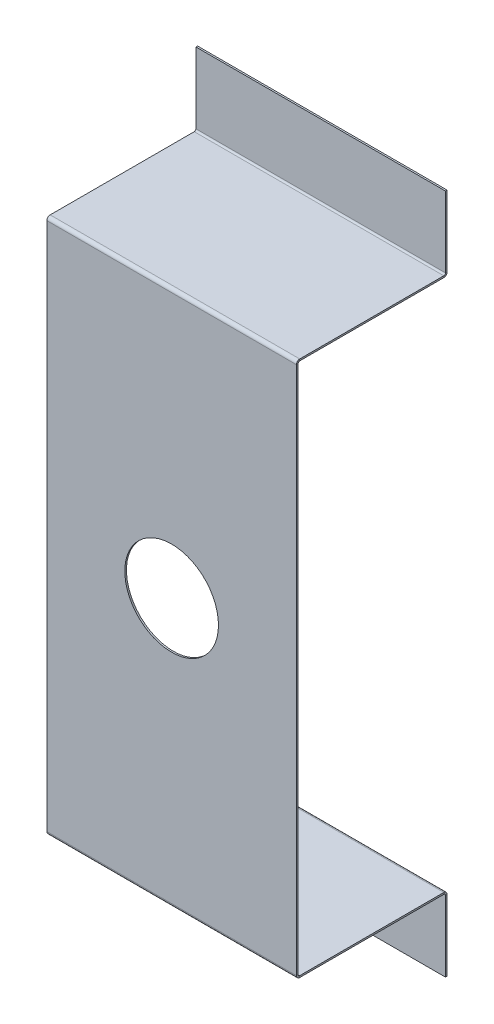
ISO-10303-21;
HEADER;
FILE_DESCRIPTION(('STEP AP214'),'2;1');
FILE_NAME('part.step','',(''),(''),'','','');
FILE_SCHEMA(('AUTOMOTIVE_DESIGN { 1 0 10303 214 1 1 1 1 }'));
ENDSEC;
DATA;
#1=APPLICATION_CONTEXT('core data for automotive mechanical design processes');
#2=APPLICATION_PROTOCOL_DEFINITION('international standard','automotive_design',2000,#1);
#3=PRODUCT_CONTEXT('',#1,'mechanical');
#4=PRODUCT('Part','Part','',(#3));
#5=PRODUCT_RELATED_PRODUCT_CATEGORY('part','',(#4));
#6=PRODUCT_DEFINITION_FORMATION('','',#4);
#7=PRODUCT_DEFINITION_CONTEXT('part definition',#1,'design');
#8=PRODUCT_DEFINITION('design','',#6,#7);
#9=PRODUCT_DEFINITION_SHAPE('','',#8);
#10=(LENGTH_UNIT() NAMED_UNIT(*) SI_UNIT(.MILLI.,.METRE.));
#11=(NAMED_UNIT(*) PLANE_ANGLE_UNIT() SI_UNIT($,.RADIAN.));
#12=(NAMED_UNIT(*) SI_UNIT($,.STERADIAN.) SOLID_ANGLE_UNIT());
#13=UNCERTAINTY_MEASURE_WITH_UNIT(LENGTH_MEASURE(1.E-05),#10,'distance_accuracy_value','');
#14=(GEOMETRIC_REPRESENTATION_CONTEXT(3) GLOBAL_UNCERTAINTY_ASSIGNED_CONTEXT((#13)) GLOBAL_UNIT_ASSIGNED_CONTEXT((#10,
#11,#12)) REPRESENTATION_CONTEXT('',''));
#15=CARTESIAN_POINT('',(0.,0.,0.));
#16=DIRECTION('',(0.,0.,1.));
#17=DIRECTION('',(1.,0.,0.));
#18=AXIS2_PLACEMENT_3D('',#15,#16,#17);
#19=CARTESIAN_POINT('',(19.05,40.64,0.));
#20=DIRECTION('',(0.,0.,-1.));
#21=DIRECTION('',(-1.,0.,0.));
#22=AXIS2_PLACEMENT_3D('',#19,#20,#21);
#23=PLANE('',#22);
#24=DIRECTION('',(0.,-1.,0.));
#25=VECTOR('',#24,1.);
#26=CARTESIAN_POINT('',(-19.05,40.64,0.));
#27=LINE('',#26,#25);
#28=CARTESIAN_POINT('',(-19.05,40.386,0.));
#29=VERTEX_POINT('',#28);
#30=CARTESIAN_POINT('',(-19.05,-40.386,0.));
#31=VERTEX_POINT('',#30);
#32=EDGE_CURVE('E244',#29,#31,#27,.T.);
#33=ORIENTED_EDGE('',*,*,#32,.F.);
#34=DIRECTION('',(-1.,0.,0.));
#35=VECTOR('',#34,1.);
#36=CARTESIAN_POINT('',(19.05,40.386,0.));
#37=LINE('',#36,#35);
#38=CARTESIAN_POINT('',(19.05,40.386,0.));
#39=VERTEX_POINT('',#38);
#40=EDGE_CURVE('E311',#39,#29,#37,.T.);
#41=ORIENTED_EDGE('',*,*,#40,.F.);
#42=DIRECTION('',(0.,-1.,0.));
#43=VECTOR('',#42,1.);
#44=CARTESIAN_POINT('',(19.05,40.64,0.));
#45=LINE('',#44,#43);
#46=CARTESIAN_POINT('',(19.05,-40.386,0.));
#47=VERTEX_POINT('',#46);
#48=EDGE_CURVE('E442',#39,#47,#45,.T.);
#49=ORIENTED_EDGE('',*,*,#48,.T.);
#50=DIRECTION('',(-1.,0.,0.));
#51=VECTOR('',#50,1.);
#52=CARTESIAN_POINT('',(19.05,-40.386,0.));
#53=LINE('',#52,#51);
#54=EDGE_CURVE('E314',#47,#31,#53,.T.);
#55=ORIENTED_EDGE('',*,*,#54,.T.);
#56=EDGE_LOOP('',(#33,#41,#49,#55));
#57=FACE_BOUND('',#56,.T.);
#58=CARTESIAN_POINT('',(0.,0.,0.));
#59=DIRECTION('',(0.,0.,1.));
#60=DIRECTION('',(1.,0.,0.));
#61=AXIS2_PLACEMENT_3D('',#58,#59,#60);
#62=CIRCLE('',#61,7.1501);
#63=CARTESIAN_POINT('',(7.1501,0.,0.));
#64=VERTEX_POINT('',#63);
#65=EDGE_CURVE('E1054',#64,#64,#62,.T.);
#66=ORIENTED_EDGE('',*,*,#65,.T.);
#67=EDGE_LOOP('',(#66));
#68=FACE_BOUND('',#67,.T.);
#69=ADVANCED_FACE('F38',(#57,#68),#23,.T.);
#70=CARTESIAN_POINT('',(19.05,40.64,0.253999999999993));
#71=DIRECTION('',(0.,0.,-1.));
#72=DIRECTION('',(-1.,0.,0.));
#73=AXIS2_PLACEMENT_3D('',#70,#71,#72);
#74=PLANE('',#73);
#75=DIRECTION('',(0.,1.,0.));
#76=VECTOR('',#75,1.);
#77=CARTESIAN_POINT('',(-19.05,40.64,0.253999999999993));
#78=LINE('',#77,#76);
#79=CARTESIAN_POINT('',(-19.05,40.386,0.253999999999993));
#80=VERTEX_POINT('',#79);
#81=CARTESIAN_POINT('',(-19.05,-40.386,0.253999999999993));
#82=VERTEX_POINT('',#81);
#83=EDGE_CURVE('E274',#80,#82,#78,.F.);
#84=ORIENTED_EDGE('',*,*,#83,.T.);
#85=DIRECTION('',(-1.,0.,0.));
#86=VECTOR('',#85,1.);
#87=CARTESIAN_POINT('',(19.05,-40.386,0.253999999999993));
#88=LINE('',#87,#86);
#89=CARTESIAN_POINT('',(19.05,-40.386,0.253999999999993));
#90=VERTEX_POINT('',#89);
#91=EDGE_CURVE('E215',#90,#82,#88,.T.);
#92=ORIENTED_EDGE('',*,*,#91,.F.);
#93=DIRECTION('',(0.,1.,0.));
#94=VECTOR('',#93,1.);
#95=CARTESIAN_POINT('',(19.05,40.64,0.253999999999993));
#96=LINE('',#95,#94);
#97=CARTESIAN_POINT('',(19.05,40.386,0.253999999999993));
#98=VERTEX_POINT('',#97);
#99=EDGE_CURVE('E206',#98,#90,#96,.F.);
#100=ORIENTED_EDGE('',*,*,#99,.F.);
#101=DIRECTION('',(-1.,0.,0.));
#102=VECTOR('',#101,1.);
#103=CARTESIAN_POINT('',(19.05,40.386,0.253999999999993));
#104=LINE('',#103,#102);
#105=EDGE_CURVE('E286',#98,#80,#104,.T.);
#106=ORIENTED_EDGE('',*,*,#105,.T.);
#107=EDGE_LOOP('',(#84,#92,#100,#106));
#108=FACE_BOUND('',#107,.T.);
#109=CARTESIAN_POINT('',(0.,0.,0.253999999999993));
#110=DIRECTION('',(0.,0.,1.));
#111=DIRECTION('',(1.,0.,0.));
#112=AXIS2_PLACEMENT_3D('',#109,#110,#111);
#113=CIRCLE('',#112,7.1501);
#114=CARTESIAN_POINT('',(7.1501,0.,0.253999999999993));
#115=VERTEX_POINT('',#114);
#116=EDGE_CURVE('E231',#115,#115,#113,.T.);
#117=ORIENTED_EDGE('',*,*,#116,.F.);
#118=EDGE_LOOP('',(#117));
#119=FACE_BOUND('',#118,.T.);
#120=ADVANCED_FACE('F396',(#108,#119),#74,.F.);
#121=CARTESIAN_POINT('',(19.05,40.64,-22.2504));
#122=DIRECTION('',(1.,0.,0.));
#123=DIRECTION('',(0.,0.,-1.));
#124=AXIS2_PLACEMENT_3D('',#121,#122,#123);
#125=PLANE('',#124);
#126=DIRECTION('',(0.,1.,0.));
#127=VECTOR('',#126,1.);
#128=CARTESIAN_POINT('',(19.05,40.64,-22.2504));
#129=LINE('',#128,#127);
#130=CARTESIAN_POINT('',(19.05,40.64,-22.2504));
#131=VERTEX_POINT('',#130);
#132=CARTESIAN_POINT('',(19.05,40.894,-22.2504));
#133=VERTEX_POINT('',#132);
#134=EDGE_CURVE('E11',#131,#133,#129,.T.);
#135=ORIENTED_EDGE('',*,*,#134,.F.);
#136=CARTESIAN_POINT('',(19.05,41.148,-22.2504));
#137=DIRECTION('',(1.,0.,0.));
#138=DIRECTION('',(0.,0.,-1.));
#139=AXIS2_PLACEMENT_3D('',#136,#137,#138);
#140=CIRCLE('',#139,0.508);
#141=CARTESIAN_POINT('',(19.05,41.148,-22.7584));
#142=VERTEX_POINT('',#141);
#143=EDGE_CURVE('E369',#142,#131,#140,.F.);
#144=ORIENTED_EDGE('',*,*,#143,.F.);
#145=DIRECTION('',(0.,0.,-1.));
#146=VECTOR('',#145,1.);
#147=CARTESIAN_POINT('',(19.05,41.148,-22.5044));
#148=LINE('',#147,#146);
#149=CARTESIAN_POINT('',(19.05,41.148,-22.5044));
#150=VERTEX_POINT('',#149);
#151=EDGE_CURVE('E47',#150,#142,#148,.T.);
#152=ORIENTED_EDGE('',*,*,#151,.F.);
#153=CARTESIAN_POINT('',(19.05,41.148,-22.2504));
#154=DIRECTION('',(1.,0.,0.));
#155=DIRECTION('',(0.,0.,-1.));
#156=AXIS2_PLACEMENT_3D('',#153,#154,#155);
#157=CIRCLE('',#156,0.254);
#158=EDGE_CURVE('E382',#150,#133,#157,.F.);
#159=ORIENTED_EDGE('',*,*,#158,.T.);
#160=EDGE_LOOP('',(#135,#144,#152,#159));
#161=FACE_BOUND('',#160,.T.);
#162=ADVANCED_FACE('F40',(#161),#125,.T.);
#163=CARTESIAN_POINT('',(19.05,41.148,-22.5044));
#164=DIRECTION('',(1.,0.,0.));
#165=DIRECTION('',(0.,0.,-1.));
#166=AXIS2_PLACEMENT_3D('',#163,#164,#165);
#167=PLANE('',#166);
#168=DIRECTION('',(0.,0.,1.));
#169=VECTOR('',#168,1.);
#170=CARTESIAN_POINT('',(19.05,40.64,0.));
#171=LINE('',#170,#169);
#172=CARTESIAN_POINT('',(19.05,40.64,-0.254000000000007));
#173=VERTEX_POINT('',#172);
#174=EDGE_CURVE('E373',#131,#173,#171,.T.);
#175=ORIENTED_EDGE('',*,*,#174,.F.);
#176=ORIENTED_EDGE('',*,*,#134,.T.);
#177=DIRECTION('',(0.,0.,-1.));
#178=VECTOR('',#177,1.);
#179=CARTESIAN_POINT('',(19.05,40.894,0.));
#180=LINE('',#179,#178);
#181=CARTESIAN_POINT('',(19.05,40.894,-0.254000000000007));
#182=VERTEX_POINT('',#181);
#183=EDGE_CURVE('E384',#133,#182,#180,.F.);
#184=ORIENTED_EDGE('',*,*,#183,.T.);
#185=DIRECTION('',(0.,-1.,0.));
#186=VECTOR('',#185,1.);
#187=CARTESIAN_POINT('',(19.05,40.894,-0.254000000000007));
#188=LINE('',#187,#186);
#189=EDGE_CURVE('E343',#182,#173,#188,.T.);
#190=ORIENTED_EDGE('',*,*,#189,.T.);
#191=EDGE_LOOP('',(#175,#176,#184,#190));
#192=FACE_BOUND('',#191,.T.);
#193=ADVANCED_FACE('F455',(#192),#167,.T.);
#194=CARTESIAN_POINT('',(-19.05,41.148,-22.7584));
#195=DIRECTION('',(-1.,0.,0.));
#196=DIRECTION('',(0.,0.,1.));
#197=AXIS2_PLACEMENT_3D('',#194,#195,#196);
#198=PLANE('',#197);
#199=DIRECTION('',(0.,0.,1.));
#200=VECTOR('',#199,1.);
#201=CARTESIAN_POINT('',(-19.05,41.148,-22.7584));
#202=LINE('',#201,#200);
#203=CARTESIAN_POINT('',(-19.05,41.148,-22.7584));
#204=VERTEX_POINT('',#203);
#205=CARTESIAN_POINT('',(-19.05,41.148,-22.5044));
#206=VERTEX_POINT('',#205);
#207=EDGE_CURVE('E349',#204,#206,#202,.T.);
#208=ORIENTED_EDGE('',*,*,#207,.F.);
#209=CARTESIAN_POINT('',(-19.05,41.148,-22.2504));
#210=DIRECTION('',(1.,0.,0.));
#211=DIRECTION('',(0.,0.,-1.));
#212=AXIS2_PLACEMENT_3D('',#209,#210,#211);
#213=CIRCLE('',#212,0.508);
#214=CARTESIAN_POINT('',(-19.05,40.64,-22.2504));
#215=VERTEX_POINT('',#214);
#216=EDGE_CURVE('E253',#204,#215,#213,.F.);
#217=ORIENTED_EDGE('',*,*,#216,.T.);
#218=DIRECTION('',(0.,-1.,0.));
#219=VECTOR('',#218,1.);
#220=CARTESIAN_POINT('',(-19.05,40.894,-22.2504));
#221=LINE('',#220,#219);
#222=CARTESIAN_POINT('',(-19.05,40.894,-22.2504));
#223=VERTEX_POINT('',#222);
#224=EDGE_CURVE('E347',#223,#215,#221,.T.);
#225=ORIENTED_EDGE('',*,*,#224,.F.);
#226=CARTESIAN_POINT('',(-19.05,41.148,-22.2504));
#227=DIRECTION('',(1.,0.,0.));
#228=DIRECTION('',(0.,0.,-1.));
#229=AXIS2_PLACEMENT_3D('',#226,#227,#228);
#230=CIRCLE('',#229,0.254);
#231=EDGE_CURVE('E265',#206,#223,#230,.F.);
#232=ORIENTED_EDGE('',*,*,#231,.F.);
#233=EDGE_LOOP('',(#208,#217,#225,#232));
#234=FACE_BOUND('',#233,.T.);
#235=ADVANCED_FACE('F698',(#234),#198,.T.);
#236=CARTESIAN_POINT('',(-19.05,40.894,-22.2504));
#237=DIRECTION('',(-1.,0.,0.));
#238=DIRECTION('',(0.,0.,1.));
#239=AXIS2_PLACEMENT_3D('',#236,#237,#238);
#240=PLANE('',#239);
#241=DIRECTION('',(0.,-1.,0.));
#242=VECTOR('',#241,1.);
#243=CARTESIAN_POINT('',(-19.05,40.64,-22.7584));
#244=LINE('',#243,#242);
#245=CARTESIAN_POINT('',(-19.05,51.9684,-22.7584));
#246=VERTEX_POINT('',#245);
#247=EDGE_CURVE('E256',#246,#204,#244,.T.);
#248=ORIENTED_EDGE('',*,*,#247,.T.);
#249=ORIENTED_EDGE('',*,*,#207,.T.);
#250=DIRECTION('',(0.,1.,0.));
#251=VECTOR('',#250,1.);
#252=CARTESIAN_POINT('',(-19.05,40.64,-22.5044));
#253=LINE('',#252,#251);
#254=CARTESIAN_POINT('',(-19.05,51.9684,-22.5044));
#255=VERTEX_POINT('',#254);
#256=EDGE_CURVE('E262',#255,#206,#253,.F.);
#257=ORIENTED_EDGE('',*,*,#256,.F.);
#258=DIRECTION('',(0.,0.,-1.));
#259=VECTOR('',#258,1.);
#260=CARTESIAN_POINT('',(-19.05,51.9684,-22.5044));
#261=LINE('',#260,#259);
#262=EDGE_CURVE('E259',#255,#246,#261,.T.);
#263=ORIENTED_EDGE('',*,*,#262,.T.);
#264=EDGE_LOOP('',(#248,#249,#257,#263));
#265=FACE_BOUND('',#264,.T.);
#266=ADVANCED_FACE('F706',(#265),#240,.T.);
#267=CARTESIAN_POINT('',(19.05,40.386,0.));
#268=DIRECTION('',(1.,0.,0.));
#269=DIRECTION('',(0.,0.,-1.));
#270=AXIS2_PLACEMENT_3D('',#267,#268,#269);
#271=PLANE('',#270);
#272=DIRECTION('',(0.,0.,1.));
#273=VECTOR('',#272,1.);
#274=CARTESIAN_POINT('',(19.05,40.386,0.));
#275=LINE('',#274,#273);
#276=EDGE_CURVE('E345',#39,#98,#275,.T.);
#277=ORIENTED_EDGE('',*,*,#276,.F.);
#278=CARTESIAN_POINT('',(19.05,40.386,-0.254000000000007));
#279=DIRECTION('',(-1.,0.,0.));
#280=DIRECTION('',(0.,0.,1.));
#281=AXIS2_PLACEMENT_3D('',#278,#279,#280);
#282=CIRCLE('',#281,0.254);
#283=EDGE_CURVE('E445',#173,#39,#282,.F.);
#284=ORIENTED_EDGE('',*,*,#283,.F.);
#285=ORIENTED_EDGE('',*,*,#189,.F.);
#286=CARTESIAN_POINT('',(19.05,40.386,-0.254000000000007));
#287=DIRECTION('',(1.,0.,0.));
#288=DIRECTION('',(0.,0.,-1.));
#289=AXIS2_PLACEMENT_3D('',#286,#287,#288);
#290=CIRCLE('',#289,0.508);
#291=EDGE_CURVE('E387',#182,#98,#290,.T.);
#292=ORIENTED_EDGE('',*,*,#291,.T.);
#293=EDGE_LOOP('',(#277,#284,#285,#292));
#294=FACE_BOUND('',#293,.T.);
#295=ADVANCED_FACE('F462',(#294),#271,.T.);
#296=CARTESIAN_POINT('',(19.05,40.894,-0.254000000000007));
#297=DIRECTION('',(1.,0.,0.));
#298=DIRECTION('',(0.,0.,-1.));
#299=AXIS2_PLACEMENT_3D('',#296,#297,#298);
#300=PLANE('',#299);
#301=ORIENTED_EDGE('',*,*,#48,.F.);
#302=ORIENTED_EDGE('',*,*,#276,.T.);
#303=ORIENTED_EDGE('',*,*,#99,.T.);
#304=DIRECTION('',(0.,0.,-1.));
#305=VECTOR('',#304,1.);
#306=CARTESIAN_POINT('',(19.05,-40.386,0.253999999999993));
#307=LINE('',#306,#305);
#308=EDGE_CURVE('E197',#90,#47,#307,.T.);
#309=ORIENTED_EDGE('',*,*,#308,.T.);
#310=EDGE_LOOP('',(#301,#302,#303,#309));
#311=FACE_BOUND('',#310,.T.);
#312=ADVANCED_FACE('F393',(#311),#300,.T.);
#313=CARTESIAN_POINT('',(-19.05,40.64,-0.254000000000007));
#314=DIRECTION('',(-1.,0.,0.));
#315=DIRECTION('',(0.,0.,1.));
#316=AXIS2_PLACEMENT_3D('',#313,#314,#315);
#317=PLANE('',#316);
#318=DIRECTION('',(0.,1.,0.));
#319=VECTOR('',#318,1.);
#320=CARTESIAN_POINT('',(-19.05,40.64,-0.254000000000007));
#321=LINE('',#320,#319);
#322=CARTESIAN_POINT('',(-19.05,40.64,-0.254000000000007));
#323=VERTEX_POINT('',#322);
#324=CARTESIAN_POINT('',(-19.05,40.894,-0.254000000000007));
#325=VERTEX_POINT('',#324);
#326=EDGE_CURVE('E341',#323,#325,#321,.T.);
#327=ORIENTED_EDGE('',*,*,#326,.F.);
#328=CARTESIAN_POINT('',(-19.05,40.386,-0.254000000000007));
#329=DIRECTION('',(-1.,0.,0.));
#330=DIRECTION('',(0.,0.,1.));
#331=AXIS2_PLACEMENT_3D('',#328,#329,#330);
#332=CIRCLE('',#331,0.254);
#333=EDGE_CURVE('E247',#323,#29,#332,.F.);
#334=ORIENTED_EDGE('',*,*,#333,.T.);
#335=DIRECTION('',(0.,0.,-1.));
#336=VECTOR('',#335,1.);
#337=CARTESIAN_POINT('',(-19.05,40.386,0.253999999999993));
#338=LINE('',#337,#336);
#339=EDGE_CURVE('E196',#80,#29,#338,.T.);
#340=ORIENTED_EDGE('',*,*,#339,.F.);
#341=CARTESIAN_POINT('',(-19.05,40.386,-0.254000000000007));
#342=DIRECTION('',(1.,0.,0.));
#343=DIRECTION('',(0.,0.,-1.));
#344=AXIS2_PLACEMENT_3D('',#341,#342,#343);
#345=CIRCLE('',#344,0.508);
#346=EDGE_CURVE('E271',#325,#80,#345,.T.);
#347=ORIENTED_EDGE('',*,*,#346,.F.);
#348=EDGE_LOOP('',(#327,#334,#340,#347));
#349=FACE_BOUND('',#348,.T.);
#350=ADVANCED_FACE('F471',(#349),#317,.T.);
#351=CARTESIAN_POINT('',(-19.05,40.386,0.253999999999993));
#352=DIRECTION('',(-1.,0.,0.));
#353=DIRECTION('',(0.,0.,1.));
#354=AXIS2_PLACEMENT_3D('',#351,#352,#353);
#355=PLANE('',#354);
#356=DIRECTION('',(0.,0.,1.));
#357=VECTOR('',#356,1.);
#358=CARTESIAN_POINT('',(-19.05,40.64,0.));
#359=LINE('',#358,#357);
#360=EDGE_CURVE('E250',#215,#323,#359,.T.);
#361=ORIENTED_EDGE('',*,*,#360,.T.);
#362=ORIENTED_EDGE('',*,*,#326,.T.);
#363=DIRECTION('',(0.,0.,-1.));
#364=VECTOR('',#363,1.);
#365=CARTESIAN_POINT('',(-19.05,40.894,0.));
#366=LINE('',#365,#364);
#367=EDGE_CURVE('E268',#223,#325,#366,.F.);
#368=ORIENTED_EDGE('',*,*,#367,.F.);
#369=ORIENTED_EDGE('',*,*,#224,.T.);
#370=EDGE_LOOP('',(#361,#362,#368,#369));
#371=FACE_BOUND('',#370,.T.);
#372=ADVANCED_FACE('F475',(#371),#355,.T.);
#373=CARTESIAN_POINT('',(19.05,-40.64,-0.254000000000007));
#374=DIRECTION('',(1.,0.,0.));
#375=DIRECTION('',(0.,0.,-1.));
#376=AXIS2_PLACEMENT_3D('',#373,#374,#375);
#377=PLANE('',#376);
#378=DIRECTION('',(0.,-1.,0.));
#379=VECTOR('',#378,1.);
#380=CARTESIAN_POINT('',(19.05,-40.64,-0.254000000000007));
#381=LINE('',#380,#379);
#382=CARTESIAN_POINT('',(19.05,-40.64,-0.254000000000007));
#383=VERTEX_POINT('',#382);
#384=CARTESIAN_POINT('',(19.05,-40.894,-0.254000000000007));
#385=VERTEX_POINT('',#384);
#386=EDGE_CURVE('E184',#383,#385,#381,.T.);
#387=ORIENTED_EDGE('',*,*,#386,.F.);
#388=CARTESIAN_POINT('',(19.05,-40.386,-0.254000000000007));
#389=DIRECTION('',(-1.,0.,0.));
#390=DIRECTION('',(0.,0.,1.));
#391=AXIS2_PLACEMENT_3D('',#388,#389,#390);
#392=CIRCLE('',#391,0.254);
#393=EDGE_CURVE('E406',#47,#383,#392,.F.);
#394=ORIENTED_EDGE('',*,*,#393,.F.);
#395=ORIENTED_EDGE('',*,*,#308,.F.);
#396=CARTESIAN_POINT('',(19.05,-40.386,-0.254000000000007));
#397=DIRECTION('',(1.,0.,0.));
#398=DIRECTION('',(0.,0.,-1.));
#399=AXIS2_PLACEMENT_3D('',#396,#397,#398);
#400=CIRCLE('',#399,0.508);
#401=EDGE_CURVE('E200',#90,#385,#400,.T.);
#402=ORIENTED_EDGE('',*,*,#401,.T.);
#403=EDGE_LOOP('',(#387,#394,#395,#402));
#404=FACE_BOUND('',#403,.T.);
#405=ADVANCED_FACE('F202',(#404),#377,.T.);
#406=CARTESIAN_POINT('',(19.05,-40.386,0.253999999999993));
#407=DIRECTION('',(1.,0.,0.));
#408=DIRECTION('',(0.,0.,-1.));
#409=AXIS2_PLACEMENT_3D('',#406,#407,#408);
#410=PLANE('',#409);
#411=DIRECTION('',(0.,0.,-1.));
#412=VECTOR('',#411,1.);
#413=CARTESIAN_POINT('',(19.05,-40.64,0.));
#414=LINE('',#413,#412);
#415=CARTESIAN_POINT('',(19.05,-40.64,-22.2504));
#416=VERTEX_POINT('',#415);
#417=EDGE_CURVE('E191',#383,#416,#414,.T.);
#418=ORIENTED_EDGE('',*,*,#417,.F.);
#419=ORIENTED_EDGE('',*,*,#386,.T.);
#420=DIRECTION('',(0.,0.,-1.));
#421=VECTOR('',#420,1.);
#422=CARTESIAN_POINT('',(19.05,-40.894,0.));
#423=LINE('',#422,#421);
#424=CARTESIAN_POINT('',(19.05,-40.894,-22.2504));
#425=VERTEX_POINT('',#424);
#426=EDGE_CURVE('E188',#385,#425,#423,.T.);
#427=ORIENTED_EDGE('',*,*,#426,.T.);
#428=DIRECTION('',(0.,1.,0.));
#429=VECTOR('',#428,1.);
#430=CARTESIAN_POINT('',(19.05,-40.894,-22.2504));
#431=LINE('',#430,#429);
#432=EDGE_CURVE('E332',#425,#416,#431,.T.);
#433=ORIENTED_EDGE('',*,*,#432,.T.);
#434=EDGE_LOOP('',(#418,#419,#427,#433));
#435=FACE_BOUND('',#434,.T.);
#436=ADVANCED_FACE('F186',(#435),#410,.T.);
#437=CARTESIAN_POINT('',(-19.05,-40.386,0.));
#438=DIRECTION('',(-1.,0.,0.));
#439=DIRECTION('',(0.,0.,1.));
#440=AXIS2_PLACEMENT_3D('',#437,#438,#439);
#441=PLANE('',#440);
#442=DIRECTION('',(0.,0.,1.));
#443=VECTOR('',#442,1.);
#444=CARTESIAN_POINT('',(-19.05,-40.386,0.));
#445=LINE('',#444,#443);
#446=EDGE_CURVE('E337',#31,#82,#445,.T.);
#447=ORIENTED_EDGE('',*,*,#446,.F.);
#448=CARTESIAN_POINT('',(-19.05,-40.386,-0.254000000000007));
#449=DIRECTION('',(-1.,0.,0.));
#450=DIRECTION('',(0.,0.,1.));
#451=AXIS2_PLACEMENT_3D('',#448,#449,#450);
#452=CIRCLE('',#451,0.254);
#453=CARTESIAN_POINT('',(-19.05,-40.64,-0.254000000000007));
#454=VERTEX_POINT('',#453);
#455=EDGE_CURVE('E241',#31,#454,#452,.F.);
#456=ORIENTED_EDGE('',*,*,#455,.T.);
#457=DIRECTION('',(0.,1.,0.));
#458=VECTOR('',#457,1.);
#459=CARTESIAN_POINT('',(-19.05,-40.894,-0.254000000000007));
#460=LINE('',#459,#458);
#461=CARTESIAN_POINT('',(-19.05,-40.894,-0.254000000000007));
#462=VERTEX_POINT('',#461);
#463=EDGE_CURVE('E335',#462,#454,#460,.T.);
#464=ORIENTED_EDGE('',*,*,#463,.F.);
#465=CARTESIAN_POINT('',(-19.05,-40.386,-0.254000000000007));
#466=DIRECTION('',(1.,0.,0.));
#467=DIRECTION('',(0.,0.,-1.));
#468=AXIS2_PLACEMENT_3D('',#465,#466,#467);
#469=CIRCLE('',#468,0.508);
#470=EDGE_CURVE('E213',#82,#462,#469,.T.);
#471=ORIENTED_EDGE('',*,*,#470,.F.);
#472=EDGE_LOOP('',(#447,#456,#464,#471));
#473=FACE_BOUND('',#472,.T.);
#474=ADVANCED_FACE('F400',(#473),#441,.T.);
#475=CARTESIAN_POINT('',(-19.05,-40.894,-0.254000000000007));
#476=DIRECTION('',(-1.,0.,0.));
#477=DIRECTION('',(0.,0.,1.));
#478=AXIS2_PLACEMENT_3D('',#475,#476,#477);
#479=PLANE('',#478);
#480=ORIENTED_EDGE('',*,*,#32,.T.);
#481=ORIENTED_EDGE('',*,*,#446,.T.);
#482=ORIENTED_EDGE('',*,*,#83,.F.);
#483=ORIENTED_EDGE('',*,*,#339,.T.);
#484=EDGE_LOOP('',(#480,#481,#482,#483));
#485=FACE_BOUND('',#484,.T.);
#486=ADVANCED_FACE('F481',(#485),#479,.T.);
#487=CARTESIAN_POINT('',(19.05,-41.148,-22.7584));
#488=DIRECTION('',(1.,0.,0.));
#489=DIRECTION('',(0.,0.,-1.));
#490=AXIS2_PLACEMENT_3D('',#487,#488,#489);
#491=PLANE('',#490);
#492=DIRECTION('',(0.,0.,1.));
#493=VECTOR('',#492,1.);
#494=CARTESIAN_POINT('',(19.05,-41.148,-22.7584));
#495=LINE('',#494,#493);
#496=CARTESIAN_POINT('',(19.05,-41.148,-22.7584));
#497=VERTEX_POINT('',#496);
#498=CARTESIAN_POINT('',(19.05,-41.148,-22.5044));
#499=VERTEX_POINT('',#498);
#500=EDGE_CURVE('E55',#497,#499,#495,.T.);
#501=ORIENTED_EDGE('',*,*,#500,.F.);
#502=CARTESIAN_POINT('',(19.05,-41.148,-22.2504));
#503=DIRECTION('',(1.,0.,0.));
#504=DIRECTION('',(0.,0.,-1.));
#505=AXIS2_PLACEMENT_3D('',#502,#503,#504);
#506=CIRCLE('',#505,0.508);
#507=EDGE_CURVE('E434',#416,#497,#506,.F.);
#508=ORIENTED_EDGE('',*,*,#507,.F.);
#509=ORIENTED_EDGE('',*,*,#432,.F.);
#510=CARTESIAN_POINT('',(19.05,-41.148,-22.2504));
#511=DIRECTION('',(1.,0.,0.));
#512=DIRECTION('',(0.,0.,-1.));
#513=AXIS2_PLACEMENT_3D('',#510,#511,#512);
#514=CIRCLE('',#513,0.254);
#515=EDGE_CURVE('E221',#425,#499,#514,.F.);
#516=ORIENTED_EDGE('',*,*,#515,.T.);
#517=EDGE_LOOP('',(#501,#508,#509,#516));
#518=FACE_BOUND('',#517,.T.);
#519=ADVANCED_FACE('F483',(#518),#491,.T.);
#520=CARTESIAN_POINT('',(19.05,-40.894,-22.2504));
#521=DIRECTION('',(1.,0.,0.));
#522=DIRECTION('',(0.,0.,-1.));
#523=AXIS2_PLACEMENT_3D('',#520,#521,#522);
#524=PLANE('',#523);
#525=DIRECTION('',(0.,-1.,0.));
#526=VECTOR('',#525,1.);
#527=CARTESIAN_POINT('',(19.05,-40.64,-22.7584));
#528=LINE('',#527,#526);
#529=CARTESIAN_POINT('',(19.05,-51.9684,-22.7584));
#530=VERTEX_POINT('',#529);
#531=EDGE_CURVE('E432',#497,#530,#528,.T.);
#532=ORIENTED_EDGE('',*,*,#531,.F.);
#533=ORIENTED_EDGE('',*,*,#500,.T.);
#534=DIRECTION('',(0.,1.,0.));
#535=VECTOR('',#534,1.);
#536=CARTESIAN_POINT('',(19.05,-40.64,-22.5044));
#537=LINE('',#536,#535);
#538=CARTESIAN_POINT('',(19.05,-51.9684,-22.5044));
#539=VERTEX_POINT('',#538);
#540=EDGE_CURVE('E133',#499,#539,#537,.F.);
#541=ORIENTED_EDGE('',*,*,#540,.T.);
#542=DIRECTION('',(0.,0.,1.));
#543=VECTOR('',#542,1.);
#544=CARTESIAN_POINT('',(19.05,-51.9684,-22.7584));
#545=LINE('',#544,#543);
#546=EDGE_CURVE('E430',#530,#539,#545,.T.);
#547=ORIENTED_EDGE('',*,*,#546,.F.);
#548=EDGE_LOOP('',(#532,#533,#541,#547));
#549=FACE_BOUND('',#548,.T.);
#550=ADVANCED_FACE('F490',(#549),#524,.T.);
#551=CARTESIAN_POINT('',(-19.05,-40.64,-22.2504));
#552=DIRECTION('',(-1.,0.,0.));
#553=DIRECTION('',(0.,0.,1.));
#554=AXIS2_PLACEMENT_3D('',#551,#552,#553);
#555=PLANE('',#554);
#556=DIRECTION('',(0.,-1.,0.));
#557=VECTOR('',#556,1.);
#558=CARTESIAN_POINT('',(-19.05,-40.64,-22.2504));
#559=LINE('',#558,#557);
#560=CARTESIAN_POINT('',(-19.05,-40.64,-22.2504));
#561=VERTEX_POINT('',#560);
#562=CARTESIAN_POINT('',(-19.05,-40.894,-22.2504));
#563=VERTEX_POINT('',#562);
#564=EDGE_CURVE('E120',#561,#563,#559,.T.);
#565=ORIENTED_EDGE('',*,*,#564,.F.);
#566=CARTESIAN_POINT('',(-19.05,-41.148,-22.2504));
#567=DIRECTION('',(1.,0.,0.));
#568=DIRECTION('',(0.,0.,-1.));
#569=AXIS2_PLACEMENT_3D('',#566,#567,#568);
#570=CIRCLE('',#569,0.508);
#571=CARTESIAN_POINT('',(-19.05,-41.148,-22.7584));
#572=VERTEX_POINT('',#571);
#573=EDGE_CURVE('E237',#561,#572,#570,.F.);
#574=ORIENTED_EDGE('',*,*,#573,.T.);
#575=DIRECTION('',(0.,0.,-1.));
#576=VECTOR('',#575,1.);
#577=CARTESIAN_POINT('',(-19.05,-41.148,-22.5044));
#578=LINE('',#577,#576);
#579=CARTESIAN_POINT('',(-19.05,-41.148,-22.5044));
#580=VERTEX_POINT('',#579);
#581=EDGE_CURVE('E127',#580,#572,#578,.T.);
#582=ORIENTED_EDGE('',*,*,#581,.F.);
#583=CARTESIAN_POINT('',(-19.05,-41.148,-22.2504));
#584=DIRECTION('',(1.,0.,0.));
#585=DIRECTION('',(0.,0.,-1.));
#586=AXIS2_PLACEMENT_3D('',#583,#584,#585);
#587=CIRCLE('',#586,0.254);
#588=EDGE_CURVE('E280',#563,#580,#587,.F.);
#589=ORIENTED_EDGE('',*,*,#588,.F.);
#590=EDGE_LOOP('',(#565,#574,#582,#589));
#591=FACE_BOUND('',#590,.T.);
#592=ADVANCED_FACE('F417',(#591),#555,.T.);
#593=CARTESIAN_POINT('',(-19.05,-41.148,-22.5044));
#594=DIRECTION('',(-1.,0.,0.));
#595=DIRECTION('',(0.,0.,1.));
#596=AXIS2_PLACEMENT_3D('',#593,#594,#595);
#597=PLANE('',#596);
#598=DIRECTION('',(0.,0.,-1.));
#599=VECTOR('',#598,1.);
#600=CARTESIAN_POINT('',(-19.05,-40.64,0.));
#601=LINE('',#600,#599);
#602=EDGE_CURVE('E239',#454,#561,#601,.T.);
#603=ORIENTED_EDGE('',*,*,#602,.T.);
#604=ORIENTED_EDGE('',*,*,#564,.T.);
#605=DIRECTION('',(0.,0.,-1.));
#606=VECTOR('',#605,1.);
#607=CARTESIAN_POINT('',(-19.05,-40.894,0.));
#608=LINE('',#607,#606);
#609=EDGE_CURVE('E278',#462,#563,#608,.T.);
#610=ORIENTED_EDGE('',*,*,#609,.F.);
#611=ORIENTED_EDGE('',*,*,#463,.T.);
#612=EDGE_LOOP('',(#603,#604,#610,#611));
#613=FACE_BOUND('',#612,.T.);
#614=ADVANCED_FACE('F402',(#613),#597,.T.);
#615=CARTESIAN_POINT('',(19.05,-40.64,-22.5044));
#616=DIRECTION('',(0.,0.,-1.));
#617=DIRECTION('',(-1.,0.,0.));
#618=AXIS2_PLACEMENT_3D('',#615,#616,#617);
#619=PLANE('',#618);
#620=DIRECTION('',(0.,1.,0.));
#621=VECTOR('',#620,1.);
#622=CARTESIAN_POINT('',(-19.05,-40.64,-22.5044));
#623=LINE('',#622,#621);
#624=CARTESIAN_POINT('',(-19.05,-51.9684,-22.5044));
#625=VERTEX_POINT('',#624);
#626=EDGE_CURVE('E227',#580,#625,#623,.F.);
#627=ORIENTED_EDGE('',*,*,#626,.T.);
#628=DIRECTION('',(-1.,0.,0.));
#629=VECTOR('',#628,1.);
#630=CARTESIAN_POINT('',(19.05,-51.9684,-22.5044));
#631=LINE('',#630,#629);
#632=EDGE_CURVE('E328',#539,#625,#631,.T.);
#633=ORIENTED_EDGE('',*,*,#632,.F.);
#634=ORIENTED_EDGE('',*,*,#540,.F.);
#635=DIRECTION('',(-1.,0.,0.));
#636=VECTOR('',#635,1.);
#637=CARTESIAN_POINT('',(19.05,-41.148,-22.5044));
#638=LINE('',#637,#636);
#639=EDGE_CURVE('E223',#499,#580,#638,.T.);
#640=ORIENTED_EDGE('',*,*,#639,.T.);
#641=EDGE_LOOP('',(#627,#633,#634,#640));
#642=FACE_BOUND('',#641,.T.);
#643=ADVANCED_FACE('F423',(#642),#619,.F.);
#644=CARTESIAN_POINT('',(19.05,-51.9684,-22.7584));
#645=DIRECTION('',(0.,-1.,0.));
#646=DIRECTION('',(0.,0.,-1.));
#647=AXIS2_PLACEMENT_3D('',#644,#645,#646);
#648=PLANE('',#647);
#649=DIRECTION('',(0.,0.,1.));
#650=VECTOR('',#649,1.);
#651=CARTESIAN_POINT('',(-19.05,-51.9684,-22.7584));
#652=LINE('',#651,#650);
#653=CARTESIAN_POINT('',(-19.05,-51.9684,-22.7584));
#654=VERTEX_POINT('',#653);
#655=EDGE_CURVE('E230',#654,#625,#652,.T.);
#656=ORIENTED_EDGE('',*,*,#655,.F.);
#657=DIRECTION('',(-1.,0.,0.));
#658=VECTOR('',#657,1.);
#659=CARTESIAN_POINT('',(19.05,-51.9684,-22.7584));
#660=LINE('',#659,#658);
#661=EDGE_CURVE('E326',#530,#654,#660,.T.);
#662=ORIENTED_EDGE('',*,*,#661,.F.);
#663=ORIENTED_EDGE('',*,*,#546,.T.);
#664=ORIENTED_EDGE('',*,*,#632,.T.);
#665=EDGE_LOOP('',(#656,#662,#663,#664));
#666=FACE_BOUND('',#665,.T.);
#667=ADVANCED_FACE('F428',(#666),#648,.T.);
#668=CARTESIAN_POINT('',(19.05,-40.64,-22.7584));
#669=DIRECTION('',(0.,0.,-1.));
#670=DIRECTION('',(-1.,0.,0.));
#671=AXIS2_PLACEMENT_3D('',#668,#669,#670);
#672=PLANE('',#671);
#673=DIRECTION('',(0.,-1.,0.));
#674=VECTOR('',#673,1.);
#675=CARTESIAN_POINT('',(-19.05,-40.64,-22.7584));
#676=LINE('',#675,#674);
#677=EDGE_CURVE('E234',#572,#654,#676,.T.);
#678=ORIENTED_EDGE('',*,*,#677,.F.);
#679=DIRECTION('',(-1.,0.,0.));
#680=VECTOR('',#679,1.);
#681=CARTESIAN_POINT('',(19.05,-41.148,-22.7584));
#682=LINE('',#681,#680);
#683=EDGE_CURVE('E323',#497,#572,#682,.T.);
#684=ORIENTED_EDGE('',*,*,#683,.F.);
#685=ORIENTED_EDGE('',*,*,#531,.T.);
#686=ORIENTED_EDGE('',*,*,#661,.T.);
#687=EDGE_LOOP('',(#678,#684,#685,#686));
#688=FACE_BOUND('',#687,.T.);
#689=ADVANCED_FACE('F510',(#688),#672,.T.);
#690=CARTESIAN_POINT('',(19.05,-41.148,-22.2504));
#691=DIRECTION('',(-1.,0.,0.));
#692=DIRECTION('',(0.,0.,1.));
#693=AXIS2_PLACEMENT_3D('',#690,#691,#692);
#694=CYLINDRICAL_SURFACE('',#693,0.508);
#695=ORIENTED_EDGE('',*,*,#573,.F.);
#696=DIRECTION('',(-1.,0.,0.));
#697=VECTOR('',#696,1.);
#698=CARTESIAN_POINT('',(19.05,-40.64,-22.2504));
#699=LINE('',#698,#697);
#700=EDGE_CURVE('E320',#416,#561,#699,.T.);
#701=ORIENTED_EDGE('',*,*,#700,.F.);
#702=ORIENTED_EDGE('',*,*,#507,.T.);
#703=ORIENTED_EDGE('',*,*,#683,.T.);
#704=EDGE_LOOP('',(#695,#701,#702,#703));
#705=FACE_BOUND('',#704,.T.);
#706=ADVANCED_FACE('F414',(#705),#694,.T.);
#707=CARTESIAN_POINT('',(19.05,-40.64,0.));
#708=DIRECTION('',(0.,1.,0.));
#709=DIRECTION('',(0.,0.,1.));
#710=AXIS2_PLACEMENT_3D('',#707,#708,#709);
#711=PLANE('',#710);
#712=ORIENTED_EDGE('',*,*,#602,.F.);
#713=DIRECTION('',(-1.,0.,0.));
#714=VECTOR('',#713,1.);
#715=CARTESIAN_POINT('',(19.05,-40.64,-0.254000000000007));
#716=LINE('',#715,#714);
#717=EDGE_CURVE('E317',#383,#454,#716,.T.);
#718=ORIENTED_EDGE('',*,*,#717,.F.);
#719=ORIENTED_EDGE('',*,*,#417,.T.);
#720=ORIENTED_EDGE('',*,*,#700,.T.);
#721=EDGE_LOOP('',(#712,#718,#719,#720));
#722=FACE_BOUND('',#721,.T.);
#723=ADVANCED_FACE('F408',(#722),#711,.T.);
#724=CARTESIAN_POINT('',(19.05,-40.386,-0.254000000000007));
#725=DIRECTION('',(-1.,0.,0.));
#726=DIRECTION('',(0.,0.,1.));
#727=AXIS2_PLACEMENT_3D('',#724,#725,#726);
#728=CYLINDRICAL_SURFACE('',#727,0.254);
#729=ORIENTED_EDGE('',*,*,#455,.F.);
#730=ORIENTED_EDGE('',*,*,#54,.F.);
#731=ORIENTED_EDGE('',*,*,#393,.T.);
#732=ORIENTED_EDGE('',*,*,#717,.T.);
#733=EDGE_LOOP('',(#729,#730,#731,#732));
#734=FACE_BOUND('',#733,.T.);
#735=ADVANCED_FACE('F405',(#734),#728,.F.);
#736=CARTESIAN_POINT('',(19.05,40.386,-0.254000000000007));
#737=DIRECTION('',(-1.,0.,0.));
#738=DIRECTION('',(0.,0.,1.));
#739=AXIS2_PLACEMENT_3D('',#736,#737,#738);
#740=CYLINDRICAL_SURFACE('',#739,0.254);
#741=ORIENTED_EDGE('',*,*,#333,.F.);
#742=DIRECTION('',(-1.,0.,0.));
#743=VECTOR('',#742,1.);
#744=CARTESIAN_POINT('',(19.05,40.64,-0.254000000000007));
#745=LINE('',#744,#743);
#746=EDGE_CURVE('E308',#173,#323,#745,.T.);
#747=ORIENTED_EDGE('',*,*,#746,.F.);
#748=ORIENTED_EDGE('',*,*,#283,.T.);
#749=ORIENTED_EDGE('',*,*,#40,.T.);
#750=EDGE_LOOP('',(#741,#747,#748,#749));
#751=FACE_BOUND('',#750,.T.);
#752=ADVANCED_FACE('F461',(#751),#740,.F.);
#753=CARTESIAN_POINT('',(19.05,40.64,0.));
#754=DIRECTION('',(0.,-1.,0.));
#755=DIRECTION('',(0.,0.,-1.));
#756=AXIS2_PLACEMENT_3D('',#753,#754,#755);
#757=PLANE('',#756);
#758=ORIENTED_EDGE('',*,*,#360,.F.);
#759=DIRECTION('',(-1.,0.,0.));
#760=VECTOR('',#759,1.);
#761=CARTESIAN_POINT('',(19.05,40.64,-22.2504));
#762=LINE('',#761,#760);
#763=EDGE_CURVE('E305',#131,#215,#762,.T.);
#764=ORIENTED_EDGE('',*,*,#763,.F.);
#765=ORIENTED_EDGE('',*,*,#174,.T.);
#766=ORIENTED_EDGE('',*,*,#746,.T.);
#767=EDGE_LOOP('',(#758,#764,#765,#766));
#768=FACE_BOUND('',#767,.T.);
#769=ADVANCED_FACE('F451',(#768),#757,.T.);
#770=CARTESIAN_POINT('',(19.05,41.148,-22.2504));
#771=DIRECTION('',(-1.,0.,0.));
#772=DIRECTION('',(0.,0.,1.));
#773=AXIS2_PLACEMENT_3D('',#770,#771,#772);
#774=CYLINDRICAL_SURFACE('',#773,0.508);
#775=ORIENTED_EDGE('',*,*,#216,.F.);
#776=DIRECTION('',(-1.,0.,0.));
#777=VECTOR('',#776,1.);
#778=CARTESIAN_POINT('',(19.05,41.148,-22.7584));
#779=LINE('',#778,#777);
#780=EDGE_CURVE('E302',#142,#204,#779,.T.);
#781=ORIENTED_EDGE('',*,*,#780,.F.);
#782=ORIENTED_EDGE('',*,*,#143,.T.);
#783=ORIENTED_EDGE('',*,*,#763,.T.);
#784=EDGE_LOOP('',(#775,#781,#782,#783));
#785=FACE_BOUND('',#784,.T.);
#786=ADVANCED_FACE('F368',(#785),#774,.T.);
#787=CARTESIAN_POINT('',(19.05,40.64,-22.7584));
#788=DIRECTION('',(0.,0.,-1.));
#789=DIRECTION('',(-1.,0.,0.));
#790=AXIS2_PLACEMENT_3D('',#787,#788,#789);
#791=PLANE('',#790);
#792=ORIENTED_EDGE('',*,*,#247,.F.);
#793=DIRECTION('',(-1.,0.,0.));
#794=VECTOR('',#793,1.);
#795=CARTESIAN_POINT('',(19.05,51.9684,-22.7584));
#796=LINE('',#795,#794);
#797=CARTESIAN_POINT('',(19.05,51.9684,-22.7584));
#798=VERTEX_POINT('',#797);
#799=EDGE_CURVE('E300',#798,#246,#796,.T.);
#800=ORIENTED_EDGE('',*,*,#799,.F.);
#801=DIRECTION('',(0.,-1.,0.));
#802=VECTOR('',#801,1.);
#803=CARTESIAN_POINT('',(19.05,40.64,-22.7584));
#804=LINE('',#803,#802);
#805=EDGE_CURVE('E357',#798,#142,#804,.T.);
#806=ORIENTED_EDGE('',*,*,#805,.T.);
#807=ORIENTED_EDGE('',*,*,#780,.T.);
#808=EDGE_LOOP('',(#792,#800,#806,#807));
#809=FACE_BOUND('',#808,.T.);
#810=ADVANCED_FACE('F375',(#809),#791,.T.);
#811=CARTESIAN_POINT('',(19.05,51.9684,-22.5044));
#812=DIRECTION('',(0.,1.,0.));
#813=DIRECTION('',(0.,0.,1.));
#814=AXIS2_PLACEMENT_3D('',#811,#812,#813);
#815=PLANE('',#814);
#816=ORIENTED_EDGE('',*,*,#262,.F.);
#817=DIRECTION('',(-1.,0.,0.));
#818=VECTOR('',#817,1.);
#819=CARTESIAN_POINT('',(19.05,51.9684,-22.5044));
#820=LINE('',#819,#818);
#821=CARTESIAN_POINT('',(19.05,51.9684,-22.5044));
#822=VERTEX_POINT('',#821);
#823=EDGE_CURVE('E298',#822,#255,#820,.T.);
#824=ORIENTED_EDGE('',*,*,#823,.F.);
#825=DIRECTION('',(0.,0.,-1.));
#826=VECTOR('',#825,1.);
#827=CARTESIAN_POINT('',(19.05,51.9684,-22.5044));
#828=LINE('',#827,#826);
#829=EDGE_CURVE('E376',#822,#798,#828,.T.);
#830=ORIENTED_EDGE('',*,*,#829,.T.);
#831=ORIENTED_EDGE('',*,*,#799,.T.);
#832=EDGE_LOOP('',(#816,#824,#830,#831));
#833=FACE_BOUND('',#832,.T.);
#834=ADVANCED_FACE('F588',(#833),#815,.T.);
#835=CARTESIAN_POINT('',(19.05,40.64,-22.5044));
#836=DIRECTION('',(0.,0.,-1.));
#837=DIRECTION('',(-1.,0.,0.));
#838=AXIS2_PLACEMENT_3D('',#835,#836,#837);
#839=PLANE('',#838);
#840=ORIENTED_EDGE('',*,*,#256,.T.);
#841=DIRECTION('',(-1.,0.,0.));
#842=VECTOR('',#841,1.);
#843=CARTESIAN_POINT('',(19.05,41.148,-22.5044));
#844=LINE('',#843,#842);
#845=EDGE_CURVE('E295',#150,#206,#844,.T.);
#846=ORIENTED_EDGE('',*,*,#845,.F.);
#847=DIRECTION('',(0.,1.,0.));
#848=VECTOR('',#847,1.);
#849=CARTESIAN_POINT('',(19.05,40.64,-22.5044));
#850=LINE('',#849,#848);
#851=EDGE_CURVE('E360',#822,#150,#850,.F.);
#852=ORIENTED_EDGE('',*,*,#851,.F.);
#853=ORIENTED_EDGE('',*,*,#823,.T.);
#854=EDGE_LOOP('',(#840,#846,#852,#853));
#855=FACE_BOUND('',#854,.T.);
#856=ADVANCED_FACE('F595',(#855),#839,.F.);
#857=CARTESIAN_POINT('',(19.05,41.148,-22.2504));
#858=DIRECTION('',(-1.,0.,0.));
#859=DIRECTION('',(0.,0.,1.));
#860=AXIS2_PLACEMENT_3D('',#857,#858,#859);
#861=CYLINDRICAL_SURFACE('',#860,0.254);
#862=ORIENTED_EDGE('',*,*,#231,.T.);
#863=DIRECTION('',(-1.,0.,0.));
#864=VECTOR('',#863,1.);
#865=CARTESIAN_POINT('',(19.05,40.894,-22.2504));
#866=LINE('',#865,#864);
#867=EDGE_CURVE('E292',#133,#223,#866,.T.);
#868=ORIENTED_EDGE('',*,*,#867,.F.);
#869=ORIENTED_EDGE('',*,*,#158,.F.);
#870=ORIENTED_EDGE('',*,*,#845,.T.);
#871=EDGE_LOOP('',(#862,#868,#869,#870));
#872=FACE_BOUND('',#871,.T.);
#873=ADVANCED_FACE('F603',(#872),#861,.F.);
#874=CARTESIAN_POINT('',(19.05,40.894,0.));
#875=DIRECTION('',(0.,-1.,0.));
#876=DIRECTION('',(0.,0.,-1.));
#877=AXIS2_PLACEMENT_3D('',#874,#875,#876);
#878=PLANE('',#877);
#879=ORIENTED_EDGE('',*,*,#367,.T.);
#880=DIRECTION('',(-1.,0.,0.));
#881=VECTOR('',#880,1.);
#882=CARTESIAN_POINT('',(19.05,40.894,-0.254000000000007));
#883=LINE('',#882,#881);
#884=EDGE_CURVE('E289',#182,#325,#883,.T.);
#885=ORIENTED_EDGE('',*,*,#884,.F.);
#886=ORIENTED_EDGE('',*,*,#183,.F.);
#887=ORIENTED_EDGE('',*,*,#867,.T.);
#888=EDGE_LOOP('',(#879,#885,#886,#887));
#889=FACE_BOUND('',#888,.T.);
#890=ADVANCED_FACE('F477',(#889),#878,.F.);
#891=CARTESIAN_POINT('',(19.05,40.386,-0.254000000000007));
#892=DIRECTION('',(-1.,0.,0.));
#893=DIRECTION('',(0.,0.,1.));
#894=AXIS2_PLACEMENT_3D('',#891,#892,#893);
#895=CYLINDRICAL_SURFACE('',#894,0.508);
#896=ORIENTED_EDGE('',*,*,#346,.T.);
#897=ORIENTED_EDGE('',*,*,#105,.F.);
#898=ORIENTED_EDGE('',*,*,#291,.F.);
#899=ORIENTED_EDGE('',*,*,#884,.T.);
#900=EDGE_LOOP('',(#896,#897,#898,#899));
#901=FACE_BOUND('',#900,.T.);
#902=ADVANCED_FACE('F480',(#901),#895,.T.);
#903=CARTESIAN_POINT('',(19.05,-40.386,-0.254000000000007));
#904=DIRECTION('',(-1.,0.,0.));
#905=DIRECTION('',(0.,0.,1.));
#906=AXIS2_PLACEMENT_3D('',#903,#904,#905);
#907=CYLINDRICAL_SURFACE('',#906,0.508);
#908=ORIENTED_EDGE('',*,*,#470,.T.);
#909=DIRECTION('',(-1.,0.,0.));
#910=VECTOR('',#909,1.);
#911=CARTESIAN_POINT('',(19.05,-40.894,-0.254000000000007));
#912=LINE('',#911,#910);
#913=EDGE_CURVE('E210',#385,#462,#912,.T.);
#914=ORIENTED_EDGE('',*,*,#913,.F.);
#915=ORIENTED_EDGE('',*,*,#401,.F.);
#916=ORIENTED_EDGE('',*,*,#91,.T.);
#917=EDGE_LOOP('',(#908,#914,#915,#916));
#918=FACE_BOUND('',#917,.T.);
#919=ADVANCED_FACE('F211',(#918),#907,.T.);
#920=CARTESIAN_POINT('',(19.05,-40.894,0.));
#921=DIRECTION('',(0.,1.,0.));
#922=DIRECTION('',(0.,0.,1.));
#923=AXIS2_PLACEMENT_3D('',#920,#921,#922);
#924=PLANE('',#923);
#925=ORIENTED_EDGE('',*,*,#609,.T.);
#926=DIRECTION('',(-1.,0.,0.));
#927=VECTOR('',#926,1.);
#928=CARTESIAN_POINT('',(19.05,-40.894,-22.2504));
#929=LINE('',#928,#927);
#930=EDGE_CURVE('E216',#425,#563,#929,.T.);
#931=ORIENTED_EDGE('',*,*,#930,.F.);
#932=ORIENTED_EDGE('',*,*,#426,.F.);
#933=ORIENTED_EDGE('',*,*,#913,.T.);
#934=EDGE_LOOP('',(#925,#931,#932,#933));
#935=FACE_BOUND('',#934,.T.);
#936=ADVANCED_FACE('F218',(#935),#924,.F.);
#937=CARTESIAN_POINT('',(19.05,-41.148,-22.2504));
#938=DIRECTION('',(-1.,0.,0.));
#939=DIRECTION('',(0.,0.,1.));
#940=AXIS2_PLACEMENT_3D('',#937,#938,#939);
#941=CYLINDRICAL_SURFACE('',#940,0.254);
#942=ORIENTED_EDGE('',*,*,#588,.T.);
#943=ORIENTED_EDGE('',*,*,#639,.F.);
#944=ORIENTED_EDGE('',*,*,#515,.F.);
#945=ORIENTED_EDGE('',*,*,#930,.T.);
#946=EDGE_LOOP('',(#942,#943,#944,#945));
#947=FACE_BOUND('',#946,.T.);
#948=ADVANCED_FACE('F420',(#947),#941,.F.);
#949=CARTESIAN_POINT('',(19.05,-41.148,-22.2504));
#950=DIRECTION('',(1.,0.,0.));
#951=DIRECTION('',(0.,0.,-1.));
#952=AXIS2_PLACEMENT_3D('',#949,#950,#951);
#953=PLANE('',#952);
#954=ORIENTED_EDGE('',*,*,#851,.T.);
#955=ORIENTED_EDGE('',*,*,#151,.T.);
#956=ORIENTED_EDGE('',*,*,#805,.F.);
#957=ORIENTED_EDGE('',*,*,#829,.F.);
#958=EDGE_LOOP('',(#954,#955,#956,#957));
#959=FACE_BOUND('',#958,.T.);
#960=ADVANCED_FACE('F354',(#959),#953,.T.);
#961=CARTESIAN_POINT('',(-19.05,-41.148,-22.2504));
#962=DIRECTION('',(1.,0.,0.));
#963=DIRECTION('',(0.,0.,-1.));
#964=AXIS2_PLACEMENT_3D('',#961,#962,#963);
#965=PLANE('',#964);
#966=ORIENTED_EDGE('',*,*,#626,.F.);
#967=ORIENTED_EDGE('',*,*,#581,.T.);
#968=ORIENTED_EDGE('',*,*,#677,.T.);
#969=ORIENTED_EDGE('',*,*,#655,.T.);
#970=EDGE_LOOP('',(#966,#967,#968,#969));
#971=FACE_BOUND('',#970,.T.);
#972=ADVANCED_FACE('F425',(#971),#965,.F.);
#973=CARTESIAN_POINT('',(0.,0.,0.253999999999993));
#974=DIRECTION('',(0.,0.,-1.));
#975=DIRECTION('',(-1.,0.,0.));
#976=AXIS2_PLACEMENT_3D('',#973,#974,#975);
#977=CYLINDRICAL_SURFACE('',#976,7.1501);
#978=ORIENTED_EDGE('',*,*,#116,.T.);
#979=EDGE_LOOP('',(#978));
#980=FACE_BOUND('',#979,.T.);
#981=ORIENTED_EDGE('',*,*,#65,.F.);
#982=EDGE_LOOP('',(#981));
#983=FACE_BOUND('',#982,.T.);
#984=ADVANCED_FACE('F658',(#980,#983),#977,.F.);
#985=CLOSED_SHELL('',(#69,#120,#162,#193,#235,#266,#295,#312,#350,#372,#405,#436,#474,#486,#519,
#550,#592,#614,#643,#667,#689,#706,#723,#735,#752,#769,#786,#810,#834,#856,#873,#890,#902,#919,
#936,#948,#960,#972,#984));
#986=MANIFOLD_SOLID_BREP('B2',#985);
#987=ADVANCED_BREP_SHAPE_REPRESENTATION('',(#18,#986),#14);
#988=SHAPE_DEFINITION_REPRESENTATION(#9,#987);
ENDSEC;
END-ISO-10303-21;
